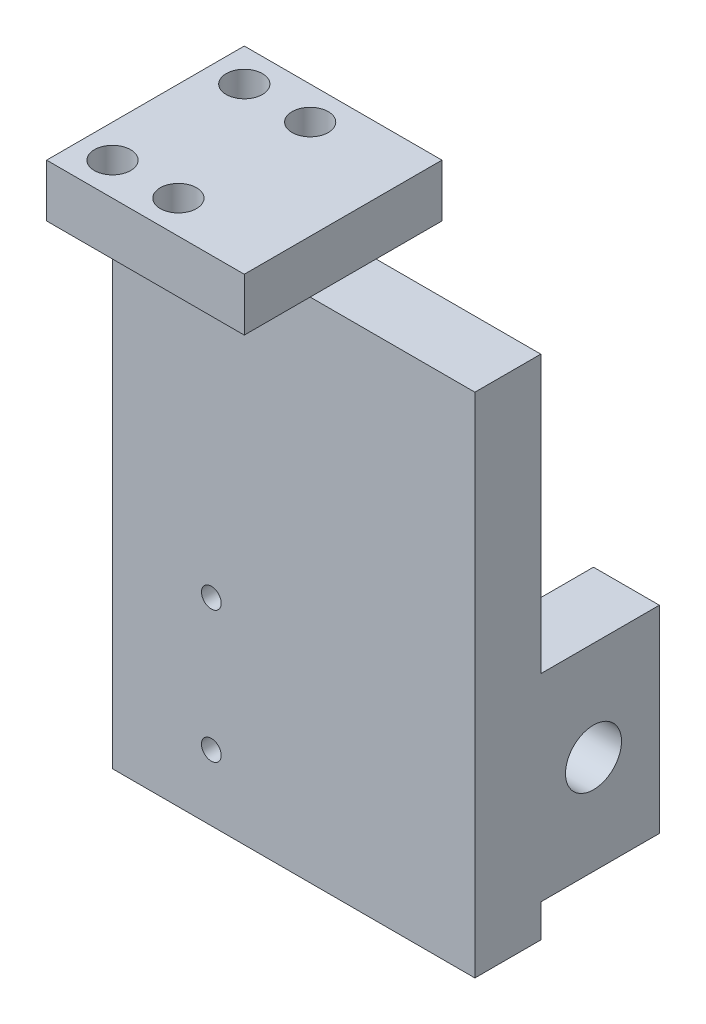
ISO-10303-21;
HEADER;
FILE_DESCRIPTION(('STEP AP214'),'2;1');
FILE_NAME('part.step','',(''),(''),'','','');
FILE_SCHEMA(('AUTOMOTIVE_DESIGN { 1 0 10303 214 1 1 1 1 }'));
ENDSEC;
DATA;
#1=APPLICATION_CONTEXT('core data for automotive mechanical design processes');
#2=APPLICATION_PROTOCOL_DEFINITION('international standard','automotive_design',2000,#1);
#3=PRODUCT_CONTEXT('',#1,'mechanical');
#4=PRODUCT('Part','Part','',(#3));
#5=PRODUCT_RELATED_PRODUCT_CATEGORY('part','',(#4));
#6=PRODUCT_DEFINITION_FORMATION('','',#4);
#7=PRODUCT_DEFINITION_CONTEXT('part definition',#1,'design');
#8=PRODUCT_DEFINITION('design','',#6,#7);
#9=PRODUCT_DEFINITION_SHAPE('','',#8);
#10=(LENGTH_UNIT() NAMED_UNIT(*) SI_UNIT(.MILLI.,.METRE.));
#11=(NAMED_UNIT(*) PLANE_ANGLE_UNIT() SI_UNIT($,.RADIAN.));
#12=(NAMED_UNIT(*) SI_UNIT($,.STERADIAN.) SOLID_ANGLE_UNIT());
#13=UNCERTAINTY_MEASURE_WITH_UNIT(LENGTH_MEASURE(1.E-05),#10,'distance_accuracy_value','');
#14=(GEOMETRIC_REPRESENTATION_CONTEXT(3) GLOBAL_UNCERTAINTY_ASSIGNED_CONTEXT((#13)) GLOBAL_UNIT_ASSIGNED_CONTEXT((#10,
#11,#12)) REPRESENTATION_CONTEXT('',''));
#15=CARTESIAN_POINT('',(0.,0.,0.));
#16=DIRECTION('',(0.,0.,1.));
#17=DIRECTION('',(1.,0.,0.));
#18=AXIS2_PLACEMENT_3D('',#15,#16,#17);
#19=CARTESIAN_POINT('',(5.,77.,13.));
#20=DIRECTION('',(0.,1.,0.));
#21=DIRECTION('',(0.,0.,1.));
#22=AXIS2_PLACEMENT_3D('',#19,#20,#21);
#23=CYLINDRICAL_SURFACE('',#22,2.75);
#24=CARTESIAN_POINT('',(5.,77.,13.));
#25=DIRECTION('',(0.,1.,0.));
#26=DIRECTION('',(0.,0.,1.));
#27=AXIS2_PLACEMENT_3D('',#24,#25,#26);
#28=CIRCLE('',#27,2.75);
#29=CARTESIAN_POINT('',(5.,77.,15.75));
#30=VERTEX_POINT('',#29);
#31=EDGE_CURVE('E142',#30,#30,#28,.F.);
#32=ORIENTED_EDGE('',*,*,#31,.T.);
#33=EDGE_LOOP('',(#32));
#34=FACE_BOUND('',#33,.T.);
#35=CARTESIAN_POINT('',(5.,85.,13.));
#36=DIRECTION('',(0.,1.,0.));
#37=DIRECTION('',(0.,0.,1.));
#38=AXIS2_PLACEMENT_3D('',#35,#36,#37);
#39=CIRCLE('',#38,2.75);
#40=CARTESIAN_POINT('',(5.,85.,15.75));
#41=VERTEX_POINT('',#40);
#42=EDGE_CURVE('E146',#41,#41,#39,.F.);
#43=ORIENTED_EDGE('',*,*,#42,.F.);
#44=EDGE_LOOP('',(#43));
#45=FACE_BOUND('',#44,.T.);
#46=ADVANCED_FACE('F16',(#34,#45),#23,.F.);
#47=CARTESIAN_POINT('',(15.,77.,13.));
#48=DIRECTION('',(0.,1.,0.));
#49=DIRECTION('',(0.,0.,1.));
#50=AXIS2_PLACEMENT_3D('',#47,#48,#49);
#51=CYLINDRICAL_SURFACE('',#50,2.75);
#52=CARTESIAN_POINT('',(15.,77.,13.));
#53=DIRECTION('',(0.,1.,0.));
#54=DIRECTION('',(0.,0.,1.));
#55=AXIS2_PLACEMENT_3D('',#52,#53,#54);
#56=CIRCLE('',#55,2.75);
#57=CARTESIAN_POINT('',(15.,77.,15.75));
#58=VERTEX_POINT('',#57);
#59=EDGE_CURVE('E129',#58,#58,#56,.F.);
#60=ORIENTED_EDGE('',*,*,#59,.T.);
#61=EDGE_LOOP('',(#60));
#62=FACE_BOUND('',#61,.T.);
#63=CARTESIAN_POINT('',(15.,85.,13.));
#64=DIRECTION('',(0.,1.,0.));
#65=DIRECTION('',(0.,0.,1.));
#66=AXIS2_PLACEMENT_3D('',#63,#64,#65);
#67=CIRCLE('',#66,2.75);
#68=CARTESIAN_POINT('',(15.,85.,15.75));
#69=VERTEX_POINT('',#68);
#70=EDGE_CURVE('E143',#69,#69,#67,.F.);
#71=ORIENTED_EDGE('',*,*,#70,.F.);
#72=EDGE_LOOP('',(#71));
#73=FACE_BOUND('',#72,.T.);
#74=ADVANCED_FACE('F189',(#62,#73),#51,.F.);
#75=CARTESIAN_POINT('',(45.,20.,10.));
#76=DIRECTION('',(1.,0.,0.));
#77=DIRECTION('',(0.,0.,-1.));
#78=AXIS2_PLACEMENT_3D('',#75,#76,#77);
#79=CYLINDRICAL_SURFACE('',#78,4.25);
#80=CARTESIAN_POINT('',(45.,20.,10.));
#81=DIRECTION('',(1.,0.,0.));
#82=DIRECTION('',(0.,0.,-1.));
#83=AXIS2_PLACEMENT_3D('',#80,#81,#82);
#84=CIRCLE('',#83,4.25);
#85=CARTESIAN_POINT('',(45.,20.,5.75));
#86=VERTEX_POINT('',#85);
#87=EDGE_CURVE('E173',#86,#86,#84,.F.);
#88=ORIENTED_EDGE('',*,*,#87,.T.);
#89=EDGE_LOOP('',(#88));
#90=FACE_BOUND('',#89,.T.);
#91=CARTESIAN_POINT('',(55.,20.,10.));
#92=DIRECTION('',(1.,0.,0.));
#93=DIRECTION('',(0.,0.,-1.));
#94=AXIS2_PLACEMENT_3D('',#91,#92,#93);
#95=CIRCLE('',#94,4.25);
#96=CARTESIAN_POINT('',(55.,20.,5.75));
#97=VERTEX_POINT('',#96);
#98=EDGE_CURVE('E19',#97,#97,#95,.F.);
#99=ORIENTED_EDGE('',*,*,#98,.F.);
#100=EDGE_LOOP('',(#99));
#101=FACE_BOUND('',#100,.T.);
#102=ADVANCED_FACE('F195',(#90,#101),#79,.F.);
#103=CARTESIAN_POINT('',(45.,5.,0.));
#104=DIRECTION('',(0.,0.,1.));
#105=DIRECTION('',(1.,0.,0.));
#106=AXIS2_PLACEMENT_3D('',#103,#104,#105);
#107=PLANE('',#106);
#108=DIRECTION('',(0.,1.,0.));
#109=VECTOR('',#108,1.);
#110=CARTESIAN_POINT('',(55.,5.,0.));
#111=LINE('',#110,#109);
#112=CARTESIAN_POINT('',(55.,5.,0.));
#113=VERTEX_POINT('',#112);
#114=CARTESIAN_POINT('',(55.,35.,0.));
#115=VERTEX_POINT('',#114);
#116=EDGE_CURVE('E111',#113,#115,#111,.T.);
#117=ORIENTED_EDGE('',*,*,#116,.F.);
#118=DIRECTION('',(1.,0.,0.));
#119=VECTOR('',#118,1.);
#120=CARTESIAN_POINT('',(45.,5.,0.));
#121=LINE('',#120,#119);
#122=CARTESIAN_POINT('',(45.,5.,0.));
#123=VERTEX_POINT('',#122);
#124=EDGE_CURVE('E108',#113,#123,#121,.F.);
#125=ORIENTED_EDGE('',*,*,#124,.T.);
#126=DIRECTION('',(0.,1.,0.));
#127=VECTOR('',#126,1.);
#128=CARTESIAN_POINT('',(45.,5.,0.));
#129=LINE('',#128,#127);
#130=CARTESIAN_POINT('',(45.,35.,0.));
#131=VERTEX_POINT('',#130);
#132=EDGE_CURVE('E136',#123,#131,#129,.T.);
#133=ORIENTED_EDGE('',*,*,#132,.T.);
#134=DIRECTION('',(1.,0.,0.));
#135=VECTOR('',#134,1.);
#136=CARTESIAN_POINT('',(45.,35.,0.));
#137=LINE('',#136,#135);
#138=EDGE_CURVE('E115',#115,#131,#137,.F.);
#139=ORIENTED_EDGE('',*,*,#138,.F.);
#140=EDGE_LOOP('',(#117,#125,#133,#139));
#141=FACE_BOUND('',#140,.T.);
#142=ADVANCED_FACE('F113',(#141),#107,.F.);
#143=CARTESIAN_POINT('',(0.,77.,8.));
#144=DIRECTION('',(0.,0.,1.));
#145=DIRECTION('',(1.,0.,0.));
#146=AXIS2_PLACEMENT_3D('',#143,#144,#145);
#147=PLANE('',#146);
#148=DIRECTION('',(0.,1.,0.));
#149=VECTOR('',#148,1.);
#150=CARTESIAN_POINT('',(30.,77.,8.));
#151=LINE('',#150,#149);
#152=CARTESIAN_POINT('',(30.,77.,8.));
#153=VERTEX_POINT('',#152);
#154=CARTESIAN_POINT('',(30.,85.,8.));
#155=VERTEX_POINT('',#154);
#156=EDGE_CURVE('E296',#153,#155,#151,.T.);
#157=ORIENTED_EDGE('',*,*,#156,.F.);
#158=DIRECTION('',(1.,0.,0.));
#159=VECTOR('',#158,1.);
#160=CARTESIAN_POINT('',(0.,77.,8.));
#161=LINE('',#160,#159);
#162=CARTESIAN_POINT('',(0.,77.,8.));
#163=VERTEX_POINT('',#162);
#164=EDGE_CURVE('E140',#153,#163,#161,.F.);
#165=ORIENTED_EDGE('',*,*,#164,.T.);
#166=DIRECTION('',(0.,1.,0.));
#167=VECTOR('',#166,1.);
#168=CARTESIAN_POINT('',(0.,77.,8.));
#169=LINE('',#168,#167);
#170=CARTESIAN_POINT('',(0.,85.,8.));
#171=VERTEX_POINT('',#170);
#172=EDGE_CURVE('E304',#163,#171,#169,.T.);
#173=ORIENTED_EDGE('',*,*,#172,.T.);
#174=DIRECTION('',(1.,0.,0.));
#175=VECTOR('',#174,1.);
#176=CARTESIAN_POINT('',(0.,85.,8.));
#177=LINE('',#176,#175);
#178=EDGE_CURVE('E144',#155,#171,#177,.F.);
#179=ORIENTED_EDGE('',*,*,#178,.F.);
#180=EDGE_LOOP('',(#157,#165,#173,#179));
#181=FACE_BOUND('',#180,.T.);
#182=ADVANCED_FACE('F266',(#181),#147,.F.);
#183=CARTESIAN_POINT('',(0.,85.,8.));
#184=DIRECTION('',(0.,1.,0.));
#185=DIRECTION('',(0.,0.,1.));
#186=AXIS2_PLACEMENT_3D('',#183,#184,#185);
#187=PLANE('',#186);
#188=CARTESIAN_POINT('',(15.,85.,33.));
#189=DIRECTION('',(0.,1.,0.));
#190=DIRECTION('',(0.,0.,1.));
#191=AXIS2_PLACEMENT_3D('',#188,#189,#190);
#192=CIRCLE('',#191,2.75);
#193=CARTESIAN_POINT('',(15.,85.,35.75));
#194=VERTEX_POINT('',#193);
#195=EDGE_CURVE('E165',#194,#194,#192,.F.);
#196=ORIENTED_EDGE('',*,*,#195,.T.);
#197=EDGE_LOOP('',(#196));
#198=FACE_BOUND('',#197,.T.);
#199=ORIENTED_EDGE('',*,*,#70,.T.);
#200=EDGE_LOOP('',(#199));
#201=FACE_BOUND('',#200,.T.);
#202=CARTESIAN_POINT('',(5.,85.,33.));
#203=DIRECTION('',(0.,1.,0.));
#204=DIRECTION('',(0.,0.,1.));
#205=AXIS2_PLACEMENT_3D('',#202,#203,#204);
#206=CIRCLE('',#205,2.75);
#207=CARTESIAN_POINT('',(5.,85.,35.75));
#208=VERTEX_POINT('',#207);
#209=EDGE_CURVE('E169',#208,#208,#206,.F.);
#210=ORIENTED_EDGE('',*,*,#209,.T.);
#211=EDGE_LOOP('',(#210));
#212=FACE_BOUND('',#211,.T.);
#213=ORIENTED_EDGE('',*,*,#42,.T.);
#214=EDGE_LOOP('',(#213));
#215=FACE_BOUND('',#214,.T.);
#216=DIRECTION('',(1.,0.,0.));
#217=VECTOR('',#216,1.);
#218=CARTESIAN_POINT('',(0.,85.,38.));
#219=LINE('',#218,#217);
#220=CARTESIAN_POINT('',(30.,85.,38.));
#221=VERTEX_POINT('',#220);
#222=CARTESIAN_POINT('',(0.,85.,38.));
#223=VERTEX_POINT('',#222);
#224=EDGE_CURVE('E172',#221,#223,#219,.F.);
#225=ORIENTED_EDGE('',*,*,#224,.F.);
#226=DIRECTION('',(0.,0.,-1.));
#227=VECTOR('',#226,1.);
#228=CARTESIAN_POINT('',(30.,85.,8.));
#229=LINE('',#228,#227);
#230=EDGE_CURVE('E299',#155,#221,#229,.F.);
#231=ORIENTED_EDGE('',*,*,#230,.F.);
#232=ORIENTED_EDGE('',*,*,#178,.T.);
#233=DIRECTION('',(0.,0.,-1.));
#234=VECTOR('',#233,1.);
#235=CARTESIAN_POINT('',(0.,85.,8.));
#236=LINE('',#235,#234);
#237=EDGE_CURVE('E306',#171,#223,#236,.F.);
#238=ORIENTED_EDGE('',*,*,#237,.T.);
#239=EDGE_LOOP('',(#225,#231,#232,#238));
#240=FACE_BOUND('',#239,.T.);
#241=ADVANCED_FACE('F185',(#198,#201,#212,#215,#240),#187,.T.);
#242=CARTESIAN_POINT('',(0.,77.,8.));
#243=DIRECTION('',(0.,1.,0.));
#244=DIRECTION('',(0.,0.,1.));
#245=AXIS2_PLACEMENT_3D('',#242,#243,#244);
#246=PLANE('',#245);
#247=ORIENTED_EDGE('',*,*,#59,.F.);
#248=EDGE_LOOP('',(#247));
#249=FACE_BOUND('',#248,.T.);
#250=ORIENTED_EDGE('',*,*,#31,.F.);
#251=EDGE_LOOP('',(#250));
#252=FACE_BOUND('',#251,.T.);
#253=DIRECTION('',(0.,0.,-1.));
#254=VECTOR('',#253,1.);
#255=CARTESIAN_POINT('',(0.,77.,8.));
#256=LINE('',#255,#254);
#257=CARTESIAN_POINT('',(0.,77.,18.));
#258=VERTEX_POINT('',#257);
#259=EDGE_CURVE('E301',#258,#163,#256,.T.);
#260=ORIENTED_EDGE('',*,*,#259,.T.);
#261=ORIENTED_EDGE('',*,*,#164,.F.);
#262=DIRECTION('',(0.,0.,-1.));
#263=VECTOR('',#262,1.);
#264=CARTESIAN_POINT('',(30.,77.,8.));
#265=LINE('',#264,#263);
#266=CARTESIAN_POINT('',(30.,77.,18.));
#267=VERTEX_POINT('',#266);
#268=EDGE_CURVE('E289',#267,#153,#265,.T.);
#269=ORIENTED_EDGE('',*,*,#268,.F.);
#270=DIRECTION('',(1.,0.,0.));
#271=VECTOR('',#270,1.);
#272=CARTESIAN_POINT('',(0.,77.,18.));
#273=LINE('',#272,#271);
#274=EDGE_CURVE('E168',#267,#258,#273,.F.);
#275=ORIENTED_EDGE('',*,*,#274,.T.);
#276=EDGE_LOOP('',(#260,#261,#269,#275));
#277=FACE_BOUND('',#276,.T.);
#278=ADVANCED_FACE('F260',(#249,#252,#277),#246,.F.);
#279=CARTESIAN_POINT('',(45.,5.,0.));
#280=DIRECTION('',(0.,1.,0.));
#281=DIRECTION('',(0.,0.,1.));
#282=AXIS2_PLACEMENT_3D('',#279,#280,#281);
#283=PLANE('',#282);
#284=DIRECTION('',(0.,0.,-1.));
#285=VECTOR('',#284,1.);
#286=CARTESIAN_POINT('',(45.,5.,0.));
#287=LINE('',#286,#285);
#288=CARTESIAN_POINT('',(45.,5.,18.));
#289=VERTEX_POINT('',#288);
#290=EDGE_CURVE('E133',#289,#123,#287,.T.);
#291=ORIENTED_EDGE('',*,*,#290,.T.);
#292=ORIENTED_EDGE('',*,*,#124,.F.);
#293=DIRECTION('',(0.,0.,1.));
#294=VECTOR('',#293,1.);
#295=CARTESIAN_POINT('',(55.,5.,0.));
#296=LINE('',#295,#294);
#297=CARTESIAN_POINT('',(55.,5.,18.));
#298=VERTEX_POINT('',#297);
#299=EDGE_CURVE('E120',#298,#113,#296,.F.);
#300=ORIENTED_EDGE('',*,*,#299,.F.);
#301=DIRECTION('',(1.,0.,0.));
#302=VECTOR('',#301,1.);
#303=CARTESIAN_POINT('',(0.,5.,18.));
#304=LINE('',#303,#302);
#305=EDGE_CURVE('E317',#298,#289,#304,.F.);
#306=ORIENTED_EDGE('',*,*,#305,.T.);
#307=EDGE_LOOP('',(#291,#292,#300,#306));
#308=FACE_BOUND('',#307,.T.);
#309=ADVANCED_FACE('F131',(#308),#283,.F.);
#310=CARTESIAN_POINT('',(45.,5.,0.));
#311=DIRECTION('',(1.,0.,0.));
#312=DIRECTION('',(0.,0.,-1.));
#313=AXIS2_PLACEMENT_3D('',#310,#311,#312);
#314=PLANE('',#313);
#315=ORIENTED_EDGE('',*,*,#87,.F.);
#316=EDGE_LOOP('',(#315));
#317=FACE_BOUND('',#316,.T.);
#318=DIRECTION('',(0.,0.,1.));
#319=VECTOR('',#318,1.);
#320=CARTESIAN_POINT('',(45.,35.,0.));
#321=LINE('',#320,#319);
#322=CARTESIAN_POINT('',(45.,35.,18.));
#323=VERTEX_POINT('',#322);
#324=EDGE_CURVE('E284',#131,#323,#321,.T.);
#325=ORIENTED_EDGE('',*,*,#324,.F.);
#326=ORIENTED_EDGE('',*,*,#132,.F.);
#327=ORIENTED_EDGE('',*,*,#290,.F.);
#328=DIRECTION('',(0.,1.,0.));
#329=VECTOR('',#328,1.);
#330=CARTESIAN_POINT('',(45.,0.,18.));
#331=LINE('',#330,#329);
#332=EDGE_CURVE('E286',#289,#323,#331,.T.);
#333=ORIENTED_EDGE('',*,*,#332,.T.);
#334=EDGE_LOOP('',(#325,#326,#327,#333));
#335=FACE_BOUND('',#334,.T.);
#336=ADVANCED_FACE('F253',(#317,#335),#314,.F.);
#337=CARTESIAN_POINT('',(45.,35.,0.));
#338=DIRECTION('',(0.,1.,0.));
#339=DIRECTION('',(0.,0.,1.));
#340=AXIS2_PLACEMENT_3D('',#337,#338,#339);
#341=PLANE('',#340);
#342=ORIENTED_EDGE('',*,*,#324,.T.);
#343=DIRECTION('',(1.,0.,0.));
#344=VECTOR('',#343,1.);
#345=CARTESIAN_POINT('',(0.,35.,18.));
#346=LINE('',#345,#344);
#347=CARTESIAN_POINT('',(55.,35.,18.));
#348=VERTEX_POINT('',#347);
#349=EDGE_CURVE('E320',#323,#348,#346,.T.);
#350=ORIENTED_EDGE('',*,*,#349,.T.);
#351=DIRECTION('',(0.,0.,1.));
#352=VECTOR('',#351,1.);
#353=CARTESIAN_POINT('',(55.,35.,0.));
#354=LINE('',#353,#352);
#355=EDGE_CURVE('E176',#348,#115,#354,.F.);
#356=ORIENTED_EDGE('',*,*,#355,.T.);
#357=ORIENTED_EDGE('',*,*,#138,.T.);
#358=EDGE_LOOP('',(#342,#350,#356,#357));
#359=FACE_BOUND('',#358,.T.);
#360=ADVANCED_FACE('F250',(#359),#341,.T.);
#361=CARTESIAN_POINT('',(30.,77.,8.));
#362=DIRECTION('',(1.,0.,0.));
#363=DIRECTION('',(0.,0.,-1.));
#364=AXIS2_PLACEMENT_3D('',#361,#362,#363);
#365=PLANE('',#364);
#366=DIRECTION('',(0.,0.,1.));
#367=VECTOR('',#366,1.);
#368=CARTESIAN_POINT('',(30.,77.,8.));
#369=LINE('',#368,#367);
#370=CARTESIAN_POINT('',(30.,77.,38.));
#371=VERTEX_POINT('',#370);
#372=CARTESIAN_POINT('',(30.,77.,28.));
#373=VERTEX_POINT('',#372);
#374=EDGE_CURVE('E34',#371,#373,#369,.F.);
#375=ORIENTED_EDGE('',*,*,#374,.T.);
#376=DIRECTION('',(0.,0.,1.));
#377=VECTOR('',#376,1.);
#378=CARTESIAN_POINT('',(30.,77.,18.));
#379=LINE('',#378,#377);
#380=EDGE_CURVE('E337',#267,#373,#379,.T.);
#381=ORIENTED_EDGE('',*,*,#380,.F.);
#382=ORIENTED_EDGE('',*,*,#268,.T.);
#383=ORIENTED_EDGE('',*,*,#156,.T.);
#384=ORIENTED_EDGE('',*,*,#230,.T.);
#385=DIRECTION('',(0.,1.,0.));
#386=VECTOR('',#385,1.);
#387=CARTESIAN_POINT('',(30.,77.,38.));
#388=LINE('',#387,#386);
#389=EDGE_CURVE('E311',#371,#221,#388,.T.);
#390=ORIENTED_EDGE('',*,*,#389,.F.);
#391=EDGE_LOOP('',(#375,#381,#382,#383,#384,#390));
#392=FACE_BOUND('',#391,.T.);
#393=ADVANCED_FACE('F246',(#392),#365,.T.);
#394=CARTESIAN_POINT('',(0.,77.,38.));
#395=DIRECTION('',(0.,0.,1.));
#396=DIRECTION('',(1.,0.,0.));
#397=AXIS2_PLACEMENT_3D('',#394,#395,#396);
#398=PLANE('',#397);
#399=ORIENTED_EDGE('',*,*,#389,.T.);
#400=ORIENTED_EDGE('',*,*,#224,.T.);
#401=DIRECTION('',(0.,1.,0.));
#402=VECTOR('',#401,1.);
#403=CARTESIAN_POINT('',(0.,77.,38.));
#404=LINE('',#403,#402);
#405=CARTESIAN_POINT('',(0.,77.,38.));
#406=VERTEX_POINT('',#405);
#407=EDGE_CURVE('E308',#223,#406,#404,.F.);
#408=ORIENTED_EDGE('',*,*,#407,.T.);
#409=DIRECTION('',(1.,0.,0.));
#410=VECTOR('',#409,1.);
#411=CARTESIAN_POINT('',(0.,77.,38.));
#412=LINE('',#411,#410);
#413=EDGE_CURVE('E164',#406,#371,#412,.T.);
#414=ORIENTED_EDGE('',*,*,#413,.T.);
#415=EDGE_LOOP('',(#399,#400,#408,#414));
#416=FACE_BOUND('',#415,.T.);
#417=ADVANCED_FACE('F242',(#416),#398,.T.);
#418=CARTESIAN_POINT('',(5.,77.,33.));
#419=DIRECTION('',(0.,1.,0.));
#420=DIRECTION('',(0.,0.,1.));
#421=AXIS2_PLACEMENT_3D('',#418,#419,#420);
#422=CYLINDRICAL_SURFACE('',#421,2.75);
#423=CARTESIAN_POINT('',(5.,77.,33.));
#424=DIRECTION('',(0.,1.,0.));
#425=DIRECTION('',(0.,0.,1.));
#426=AXIS2_PLACEMENT_3D('',#423,#424,#425);
#427=CIRCLE('',#426,2.75);
#428=CARTESIAN_POINT('',(5.,77.,35.75));
#429=VERTEX_POINT('',#428);
#430=EDGE_CURVE('E161',#429,#429,#427,.F.);
#431=ORIENTED_EDGE('',*,*,#430,.T.);
#432=EDGE_LOOP('',(#431));
#433=FACE_BOUND('',#432,.T.);
#434=ORIENTED_EDGE('',*,*,#209,.F.);
#435=EDGE_LOOP('',(#434));
#436=FACE_BOUND('',#435,.T.);
#437=ADVANCED_FACE('F238',(#433,#436),#422,.F.);
#438=CARTESIAN_POINT('',(15.,77.,33.));
#439=DIRECTION('',(0.,1.,0.));
#440=DIRECTION('',(0.,0.,1.));
#441=AXIS2_PLACEMENT_3D('',#438,#439,#440);
#442=CYLINDRICAL_SURFACE('',#441,2.75);
#443=CARTESIAN_POINT('',(15.,77.,33.));
#444=DIRECTION('',(0.,1.,0.));
#445=DIRECTION('',(0.,0.,1.));
#446=AXIS2_PLACEMENT_3D('',#443,#444,#445);
#447=CIRCLE('',#446,2.75);
#448=CARTESIAN_POINT('',(15.,77.,35.75));
#449=VERTEX_POINT('',#448);
#450=EDGE_CURVE('E158',#449,#449,#447,.F.);
#451=ORIENTED_EDGE('',*,*,#450,.T.);
#452=EDGE_LOOP('',(#451));
#453=FACE_BOUND('',#452,.T.);
#454=ORIENTED_EDGE('',*,*,#195,.F.);
#455=EDGE_LOOP('',(#454));
#456=FACE_BOUND('',#455,.T.);
#457=ADVANCED_FACE('F234',(#453,#456),#442,.F.);
#458=CARTESIAN_POINT('',(0.,0.,18.));
#459=DIRECTION('',(0.,0.,1.));
#460=DIRECTION('',(1.,0.,0.));
#461=AXIS2_PLACEMENT_3D('',#458,#459,#460);
#462=PLANE('',#461);
#463=CARTESIAN_POINT('',(15.,30.,18.));
#464=DIRECTION('',(0.,0.,1.));
#465=DIRECTION('',(1.,0.,0.));
#466=AXIS2_PLACEMENT_3D('',#463,#464,#465);
#467=CIRCLE('',#466,1.5);
#468=CARTESIAN_POINT('',(16.5,30.,18.));
#469=VERTEX_POINT('',#468);
#470=EDGE_CURVE('E151',#469,#469,#467,.T.);
#471=ORIENTED_EDGE('',*,*,#470,.T.);
#472=EDGE_LOOP('',(#471));
#473=FACE_BOUND('',#472,.T.);
#474=CARTESIAN_POINT('',(15.,10.,18.));
#475=DIRECTION('',(0.,0.,1.));
#476=DIRECTION('',(1.,0.,0.));
#477=AXIS2_PLACEMENT_3D('',#474,#475,#476);
#478=CIRCLE('',#477,1.5);
#479=CARTESIAN_POINT('',(16.5,10.,18.));
#480=VERTEX_POINT('',#479);
#481=EDGE_CURVE('E155',#480,#480,#478,.T.);
#482=ORIENTED_EDGE('',*,*,#481,.T.);
#483=EDGE_LOOP('',(#482));
#484=FACE_BOUND('',#483,.T.);
#485=DIRECTION('',(0.,1.,0.));
#486=VECTOR('',#485,1.);
#487=CARTESIAN_POINT('',(55.,0.,18.));
#488=LINE('',#487,#486);
#489=CARTESIAN_POINT('',(55.,77.,18.));
#490=VERTEX_POINT('',#489);
#491=EDGE_CURVE('E332',#348,#490,#488,.T.);
#492=ORIENTED_EDGE('',*,*,#491,.F.);
#493=ORIENTED_EDGE('',*,*,#349,.F.);
#494=ORIENTED_EDGE('',*,*,#332,.F.);
#495=ORIENTED_EDGE('',*,*,#305,.F.);
#496=DIRECTION('',(0.,1.,0.));
#497=VECTOR('',#496,1.);
#498=CARTESIAN_POINT('',(55.,0.,18.));
#499=LINE('',#498,#497);
#500=CARTESIAN_POINT('',(55.,0.,18.));
#501=VERTEX_POINT('',#500);
#502=EDGE_CURVE('E126',#501,#298,#499,.T.);
#503=ORIENTED_EDGE('',*,*,#502,.F.);
#504=DIRECTION('',(1.,0.,0.));
#505=VECTOR('',#504,1.);
#506=CARTESIAN_POINT('',(0.,0.,18.));
#507=LINE('',#506,#505);
#508=CARTESIAN_POINT('',(0.,0.,18.));
#509=VERTEX_POINT('',#508);
#510=EDGE_CURVE('E325',#501,#509,#507,.F.);
#511=ORIENTED_EDGE('',*,*,#510,.T.);
#512=DIRECTION('',(0.,1.,0.));
#513=VECTOR('',#512,1.);
#514=CARTESIAN_POINT('',(0.,0.,18.));
#515=LINE('',#514,#513);
#516=EDGE_CURVE('E322',#509,#258,#515,.T.);
#517=ORIENTED_EDGE('',*,*,#516,.T.);
#518=ORIENTED_EDGE('',*,*,#274,.F.);
#519=DIRECTION('',(1.,0.,0.));
#520=VECTOR('',#519,1.);
#521=CARTESIAN_POINT('',(0.,77.,18.));
#522=LINE('',#521,#520);
#523=EDGE_CURVE('E334',#490,#267,#522,.F.);
#524=ORIENTED_EDGE('',*,*,#523,.F.);
#525=EDGE_LOOP('',(#492,#493,#494,#495,#503,#511,#517,#518,#524));
#526=FACE_BOUND('',#525,.T.);
#527=ADVANCED_FACE('F230',(#473,#484,#526),#462,.F.);
#528=CARTESIAN_POINT('',(0.,0.,18.));
#529=DIRECTION('',(1.,0.,0.));
#530=DIRECTION('',(0.,0.,-1.));
#531=AXIS2_PLACEMENT_3D('',#528,#529,#530);
#532=PLANE('',#531);
#533=DIRECTION('',(0.,1.,0.));
#534=VECTOR('',#533,1.);
#535=CARTESIAN_POINT('',(0.,0.,28.));
#536=LINE('',#535,#534);
#537=CARTESIAN_POINT('',(0.,77.,28.));
#538=VERTEX_POINT('',#537);
#539=CARTESIAN_POINT('',(0.,0.,28.));
#540=VERTEX_POINT('',#539);
#541=EDGE_CURVE('E154',#538,#540,#536,.F.);
#542=ORIENTED_EDGE('',*,*,#541,.F.);
#543=DIRECTION('',(0.,0.,1.));
#544=VECTOR('',#543,1.);
#545=CARTESIAN_POINT('',(0.,77.,8.));
#546=LINE('',#545,#544);
#547=EDGE_CURVE('E343',#538,#406,#546,.T.);
#548=ORIENTED_EDGE('',*,*,#547,.T.);
#549=ORIENTED_EDGE('',*,*,#407,.F.);
#550=ORIENTED_EDGE('',*,*,#237,.F.);
#551=ORIENTED_EDGE('',*,*,#172,.F.);
#552=ORIENTED_EDGE('',*,*,#259,.F.);
#553=ORIENTED_EDGE('',*,*,#516,.F.);
#554=DIRECTION('',(0.,0.,1.));
#555=VECTOR('',#554,1.);
#556=CARTESIAN_POINT('',(0.,0.,18.));
#557=LINE('',#556,#555);
#558=EDGE_CURVE('E327',#509,#540,#557,.T.);
#559=ORIENTED_EDGE('',*,*,#558,.T.);
#560=EDGE_LOOP('',(#542,#548,#549,#550,#551,#552,#553,#559));
#561=FACE_BOUND('',#560,.T.);
#562=ADVANCED_FACE('F226',(#561),#532,.F.);
#563=CARTESIAN_POINT('',(0.,0.,18.));
#564=DIRECTION('',(0.,1.,0.));
#565=DIRECTION('',(0.,0.,1.));
#566=AXIS2_PLACEMENT_3D('',#563,#564,#565);
#567=PLANE('',#566);
#568=DIRECTION('',(1.,0.,0.));
#569=VECTOR('',#568,1.);
#570=CARTESIAN_POINT('',(0.,0.,28.));
#571=LINE('',#570,#569);
#572=CARTESIAN_POINT('',(55.,0.,28.));
#573=VERTEX_POINT('',#572);
#574=EDGE_CURVE('E349',#540,#573,#571,.T.);
#575=ORIENTED_EDGE('',*,*,#574,.F.);
#576=ORIENTED_EDGE('',*,*,#558,.F.);
#577=ORIENTED_EDGE('',*,*,#510,.F.);
#578=DIRECTION('',(0.,0.,-1.));
#579=VECTOR('',#578,1.);
#580=CARTESIAN_POINT('',(55.,0.,18.));
#581=LINE('',#580,#579);
#582=EDGE_CURVE('E329',#573,#501,#581,.T.);
#583=ORIENTED_EDGE('',*,*,#582,.F.);
#584=EDGE_LOOP('',(#575,#576,#577,#583));
#585=FACE_BOUND('',#584,.T.);
#586=ADVANCED_FACE('F223',(#585),#567,.F.);
#587=CARTESIAN_POINT('',(55.,0.,18.));
#588=DIRECTION('',(1.,0.,0.));
#589=DIRECTION('',(0.,0.,-1.));
#590=AXIS2_PLACEMENT_3D('',#587,#588,#589);
#591=PLANE('',#590);
#592=ORIENTED_EDGE('',*,*,#491,.T.);
#593=DIRECTION('',(0.,0.,1.));
#594=VECTOR('',#593,1.);
#595=CARTESIAN_POINT('',(55.,77.,18.));
#596=LINE('',#595,#594);
#597=CARTESIAN_POINT('',(55.,77.,28.));
#598=VERTEX_POINT('',#597);
#599=EDGE_CURVE('E339',#598,#490,#596,.F.);
#600=ORIENTED_EDGE('',*,*,#599,.F.);
#601=DIRECTION('',(0.,1.,0.));
#602=VECTOR('',#601,1.);
#603=CARTESIAN_POINT('',(55.,0.,28.));
#604=LINE('',#603,#602);
#605=EDGE_CURVE('E352',#573,#598,#604,.T.);
#606=ORIENTED_EDGE('',*,*,#605,.F.);
#607=ORIENTED_EDGE('',*,*,#582,.T.);
#608=ORIENTED_EDGE('',*,*,#502,.T.);
#609=ORIENTED_EDGE('',*,*,#299,.T.);
#610=ORIENTED_EDGE('',*,*,#116,.T.);
#611=ORIENTED_EDGE('',*,*,#355,.F.);
#612=EDGE_LOOP('',(#592,#600,#606,#607,#608,#609,#610,#611));
#613=FACE_BOUND('',#612,.T.);
#614=ORIENTED_EDGE('',*,*,#98,.T.);
#615=EDGE_LOOP('',(#614));
#616=FACE_BOUND('',#615,.T.);
#617=ADVANCED_FACE('F122',(#613,#616),#591,.T.);
#618=CARTESIAN_POINT('',(0.,77.,18.));
#619=DIRECTION('',(0.,1.,0.));
#620=DIRECTION('',(0.,0.,1.));
#621=AXIS2_PLACEMENT_3D('',#618,#619,#620);
#622=PLANE('',#621);
#623=DIRECTION('',(1.,0.,0.));
#624=VECTOR('',#623,1.);
#625=CARTESIAN_POINT('',(0.,77.,28.));
#626=LINE('',#625,#624);
#627=EDGE_CURVE('E355',#598,#373,#626,.F.);
#628=ORIENTED_EDGE('',*,*,#627,.F.);
#629=ORIENTED_EDGE('',*,*,#599,.T.);
#630=ORIENTED_EDGE('',*,*,#523,.T.);
#631=ORIENTED_EDGE('',*,*,#380,.T.);
#632=EDGE_LOOP('',(#628,#629,#630,#631));
#633=FACE_BOUND('',#632,.T.);
#634=ADVANCED_FACE('F216',(#633),#622,.T.);
#635=CARTESIAN_POINT('',(0.,77.,8.));
#636=DIRECTION('',(0.,1.,0.));
#637=DIRECTION('',(0.,0.,1.));
#638=AXIS2_PLACEMENT_3D('',#635,#636,#637);
#639=PLANE('',#638);
#640=ORIENTED_EDGE('',*,*,#450,.F.);
#641=EDGE_LOOP('',(#640));
#642=FACE_BOUND('',#641,.T.);
#643=ORIENTED_EDGE('',*,*,#430,.F.);
#644=EDGE_LOOP('',(#643));
#645=FACE_BOUND('',#644,.T.);
#646=ORIENTED_EDGE('',*,*,#547,.F.);
#647=DIRECTION('',(1.,0.,0.));
#648=VECTOR('',#647,1.);
#649=CARTESIAN_POINT('',(0.,77.,28.));
#650=LINE('',#649,#648);
#651=EDGE_CURVE('E150',#373,#538,#650,.F.);
#652=ORIENTED_EDGE('',*,*,#651,.F.);
#653=ORIENTED_EDGE('',*,*,#374,.F.);
#654=ORIENTED_EDGE('',*,*,#413,.F.);
#655=EDGE_LOOP('',(#646,#652,#653,#654));
#656=FACE_BOUND('',#655,.T.);
#657=ADVANCED_FACE('F212',(#642,#645,#656),#639,.F.);
#658=CARTESIAN_POINT('',(15.,10.,18.));
#659=DIRECTION('',(0.,0.,1.));
#660=DIRECTION('',(1.,0.,0.));
#661=AXIS2_PLACEMENT_3D('',#658,#659,#660);
#662=CYLINDRICAL_SURFACE('',#661,1.5);
#663=ORIENTED_EDGE('',*,*,#481,.F.);
#664=EDGE_LOOP('',(#663));
#665=FACE_BOUND('',#664,.T.);
#666=CARTESIAN_POINT('',(15.,10.,28.));
#667=DIRECTION('',(0.,0.,1.));
#668=DIRECTION('',(1.,0.,0.));
#669=AXIS2_PLACEMENT_3D('',#666,#667,#668);
#670=CIRCLE('',#669,1.5);
#671=CARTESIAN_POINT('',(16.5,10.,28.));
#672=VERTEX_POINT('',#671);
#673=EDGE_CURVE('E25',#672,#672,#670,.F.);
#674=ORIENTED_EDGE('',*,*,#673,.F.);
#675=EDGE_LOOP('',(#674));
#676=FACE_BOUND('',#675,.T.);
#677=ADVANCED_FACE('F205',(#665,#676),#662,.F.);
#678=CARTESIAN_POINT('',(15.,30.,18.));
#679=DIRECTION('',(0.,0.,1.));
#680=DIRECTION('',(1.,0.,0.));
#681=AXIS2_PLACEMENT_3D('',#678,#679,#680);
#682=CYLINDRICAL_SURFACE('',#681,1.5);
#683=ORIENTED_EDGE('',*,*,#470,.F.);
#684=EDGE_LOOP('',(#683));
#685=FACE_BOUND('',#684,.T.);
#686=CARTESIAN_POINT('',(15.,30.,28.));
#687=DIRECTION('',(0.,0.,1.));
#688=DIRECTION('',(1.,0.,0.));
#689=AXIS2_PLACEMENT_3D('',#686,#687,#688);
#690=CIRCLE('',#689,1.5);
#691=CARTESIAN_POINT('',(16.5,30.,28.));
#692=VERTEX_POINT('',#691);
#693=EDGE_CURVE('E11',#692,#692,#690,.F.);
#694=ORIENTED_EDGE('',*,*,#693,.F.);
#695=EDGE_LOOP('',(#694));
#696=FACE_BOUND('',#695,.T.);
#697=ADVANCED_FACE('F199',(#685,#696),#682,.F.);
#698=CARTESIAN_POINT('',(0.,0.,28.));
#699=DIRECTION('',(0.,0.,1.));
#700=DIRECTION('',(1.,0.,0.));
#701=AXIS2_PLACEMENT_3D('',#698,#699,#700);
#702=PLANE('',#701);
#703=ORIENTED_EDGE('',*,*,#693,.T.);
#704=EDGE_LOOP('',(#703));
#705=FACE_BOUND('',#704,.T.);
#706=ORIENTED_EDGE('',*,*,#673,.T.);
#707=EDGE_LOOP('',(#706));
#708=FACE_BOUND('',#707,.T.);
#709=ORIENTED_EDGE('',*,*,#627,.T.);
#710=ORIENTED_EDGE('',*,*,#651,.T.);
#711=ORIENTED_EDGE('',*,*,#541,.T.);
#712=ORIENTED_EDGE('',*,*,#574,.T.);
#713=ORIENTED_EDGE('',*,*,#605,.T.);
#714=EDGE_LOOP('',(#709,#710,#711,#712,#713));
#715=FACE_BOUND('',#714,.T.);
#716=ADVANCED_FACE('F197',(#705,#708,#715),#702,.T.);
#717=CLOSED_SHELL('',(#46,#74,#102,#142,#182,#241,#278,#309,#336,#360,#393,#417,#437,#457,#527,
#562,#586,#617,#634,#657,#677,#697,#716));
#718=MANIFOLD_SOLID_BREP('B1',#717);
#719=ADVANCED_BREP_SHAPE_REPRESENTATION('',(#18,#718),#14);
#720=SHAPE_DEFINITION_REPRESENTATION(#9,#719);
ENDSEC;
END-ISO-10303-21;
